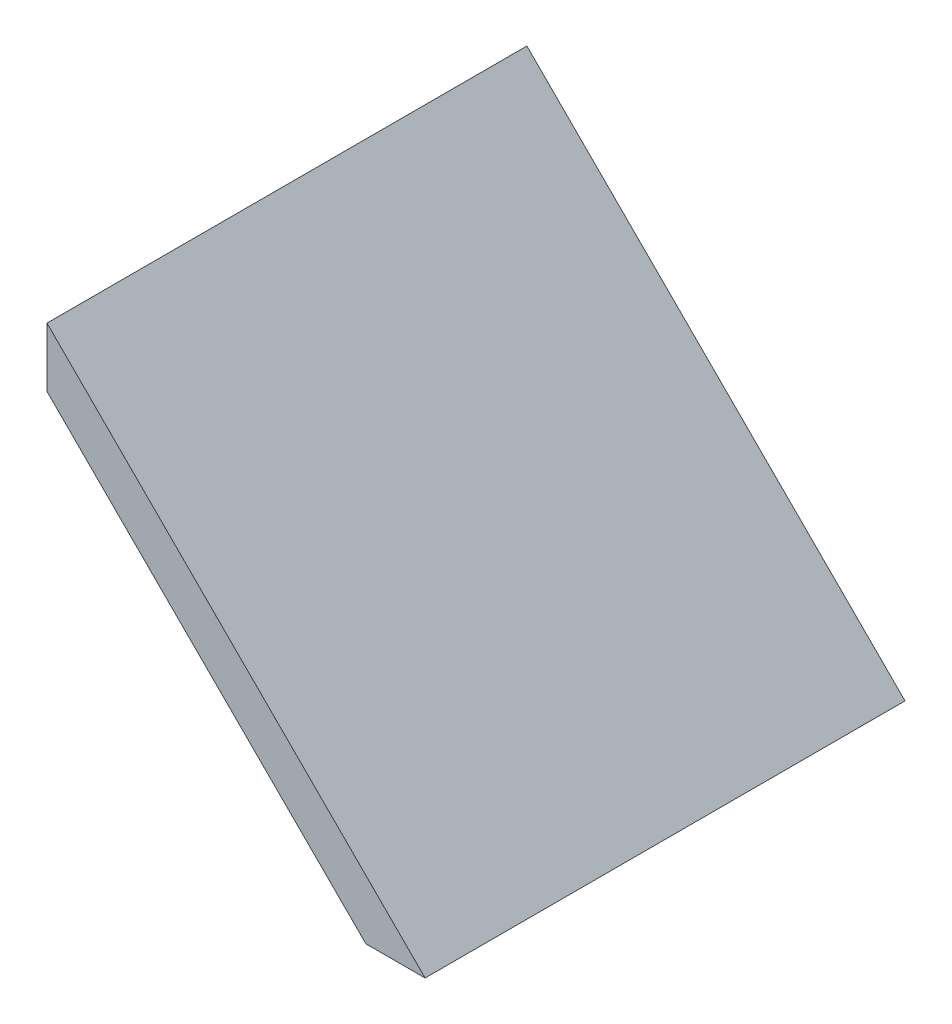
ISO-10303-21;
HEADER;
FILE_DESCRIPTION(('STEP AP214'),'2;1');
FILE_NAME('part.step','',(''),(''),'','','');
FILE_SCHEMA(('AUTOMOTIVE_DESIGN { 1 0 10303 214 1 1 1 1 }'));
ENDSEC;
DATA;
#1=APPLICATION_CONTEXT('core data for automotive mechanical design processes');
#2=APPLICATION_PROTOCOL_DEFINITION('international standard','automotive_design',2000,#1);
#3=PRODUCT_CONTEXT('',#1,'mechanical');
#4=PRODUCT('Part','Part','',(#3));
#5=PRODUCT_RELATED_PRODUCT_CATEGORY('part','',(#4));
#6=PRODUCT_DEFINITION_FORMATION('','',#4);
#7=PRODUCT_DEFINITION_CONTEXT('part definition',#1,'design');
#8=PRODUCT_DEFINITION('design','',#6,#7);
#9=PRODUCT_DEFINITION_SHAPE('','',#8);
#10=(LENGTH_UNIT() NAMED_UNIT(*) SI_UNIT(.MILLI.,.METRE.));
#11=(NAMED_UNIT(*) PLANE_ANGLE_UNIT() SI_UNIT($,.RADIAN.));
#12=(NAMED_UNIT(*) SI_UNIT($,.STERADIAN.) SOLID_ANGLE_UNIT());
#13=UNCERTAINTY_MEASURE_WITH_UNIT(LENGTH_MEASURE(1.E-05),#10,'distance_accuracy_value','');
#14=(GEOMETRIC_REPRESENTATION_CONTEXT(3) GLOBAL_UNCERTAINTY_ASSIGNED_CONTEXT((#13)) GLOBAL_UNIT_ASSIGNED_CONTEXT((#10,
#11,#12)) REPRESENTATION_CONTEXT('',''));
#15=CARTESIAN_POINT('',(0.,0.,0.));
#16=DIRECTION('',(0.,0.,1.));
#17=DIRECTION('',(1.,0.,0.));
#18=AXIS2_PLACEMENT_3D('',#15,#16,#17);
#19=CARTESIAN_POINT('',(135.513203435596,0.,172.));
#20=DIRECTION('',(0.,1.,0.));
#21=DIRECTION('',(-1.,0.,0.));
#22=AXIS2_PLACEMENT_3D('',#19,#20,#21);
#23=PLANE('',#22);
#24=DIRECTION('',(1.,0.,0.));
#25=VECTOR('',#24,1.);
#26=CARTESIAN_POINT('',(135.513203435596,0.,0.));
#27=LINE('',#26,#25);
#28=CARTESIAN_POINT('',(114.3,0.,0.));
#29=VERTEX_POINT('',#28);
#30=CARTESIAN_POINT('',(135.513203435596,0.,0.));
#31=VERTEX_POINT('',#30);
#32=EDGE_CURVE('E107',#29,#31,#27,.T.);
#33=ORIENTED_EDGE('',*,*,#32,.T.);
#34=DIRECTION('',(0.,0.,-1.));
#35=VECTOR('',#34,1.);
#36=CARTESIAN_POINT('',(135.513203435596,0.,172.));
#37=LINE('',#36,#35);
#38=CARTESIAN_POINT('',(135.513203435596,0.,172.));
#39=VERTEX_POINT('',#38);
#40=EDGE_CURVE('E11',#39,#31,#37,.T.);
#41=ORIENTED_EDGE('',*,*,#40,.F.);
#42=DIRECTION('',(1.,0.,0.));
#43=VECTOR('',#42,1.);
#44=CARTESIAN_POINT('',(135.513203435596,0.,172.));
#45=LINE('',#44,#43);
#46=CARTESIAN_POINT('',(114.3,0.,172.));
#47=VERTEX_POINT('',#46);
#48=EDGE_CURVE('E91',#47,#39,#45,.T.);
#49=ORIENTED_EDGE('',*,*,#48,.F.);
#50=DIRECTION('',(0.,0.,-1.));
#51=VECTOR('',#50,1.);
#52=CARTESIAN_POINT('',(114.3,0.,172.));
#53=LINE('',#52,#51);
#54=EDGE_CURVE('E103',#47,#29,#53,.T.);
#55=ORIENTED_EDGE('',*,*,#54,.T.);
#56=EDGE_LOOP('',(#33,#41,#49,#55));
#57=FACE_BOUND('',#56,.T.);
#58=ADVANCED_FACE('F39',(#57),#23,.F.);
#59=CARTESIAN_POINT('',(0.,135.513203435596,172.));
#60=DIRECTION('',(-0.707106781186547,-0.707106781186548,0.));
#61=DIRECTION('',(0.707106781186548,-0.707106781186547,0.));
#62=AXIS2_PLACEMENT_3D('',#59,#60,#61);
#63=PLANE('',#62);
#64=DIRECTION('',(-0.707106781186548,0.707106781186547,0.));
#65=VECTOR('',#64,1.);
#66=CARTESIAN_POINT('',(0.,135.513203435596,0.));
#67=LINE('',#66,#65);
#68=CARTESIAN_POINT('',(0.,135.513203435596,0.));
#69=VERTEX_POINT('',#68);
#70=EDGE_CURVE('E96',#31,#69,#67,.T.);
#71=ORIENTED_EDGE('',*,*,#70,.T.);
#72=DIRECTION('',(0.,0.,-1.));
#73=VECTOR('',#72,1.);
#74=CARTESIAN_POINT('',(0.,135.513203435596,172.));
#75=LINE('',#74,#73);
#76=CARTESIAN_POINT('',(0.,135.513203435596,172.));
#77=VERTEX_POINT('',#76);
#78=EDGE_CURVE('E48',#77,#69,#75,.T.);
#79=ORIENTED_EDGE('',*,*,#78,.F.);
#80=DIRECTION('',(-0.707106781186548,0.707106781186547,0.));
#81=VECTOR('',#80,1.);
#82=CARTESIAN_POINT('',(0.,135.513203435596,172.));
#83=LINE('',#82,#81);
#84=EDGE_CURVE('E86',#39,#77,#83,.T.);
#85=ORIENTED_EDGE('',*,*,#84,.F.);
#86=ORIENTED_EDGE('',*,*,#40,.T.);
#87=EDGE_LOOP('',(#71,#79,#85,#86));
#88=FACE_BOUND('',#87,.T.);
#89=ADVANCED_FACE('F95',(#88),#63,.F.);
#90=CARTESIAN_POINT('',(0.,114.3,172.));
#91=DIRECTION('',(1.,0.,0.));
#92=DIRECTION('',(0.,1.,0.));
#93=AXIS2_PLACEMENT_3D('',#90,#91,#92);
#94=PLANE('',#93);
#95=DIRECTION('',(0.,-1.,0.));
#96=VECTOR('',#95,1.);
#97=CARTESIAN_POINT('',(0.,114.3,0.));
#98=LINE('',#97,#96);
#99=CARTESIAN_POINT('',(0.,114.3,0.));
#100=VERTEX_POINT('',#99);
#101=EDGE_CURVE('E73',#69,#100,#98,.T.);
#102=ORIENTED_EDGE('',*,*,#101,.T.);
#103=DIRECTION('',(0.,0.,-1.));
#104=VECTOR('',#103,1.);
#105=CARTESIAN_POINT('',(0.,114.3,172.));
#106=LINE('',#105,#104);
#107=CARTESIAN_POINT('',(0.,114.3,172.));
#108=VERTEX_POINT('',#107);
#109=EDGE_CURVE('E98',#108,#100,#106,.T.);
#110=ORIENTED_EDGE('',*,*,#109,.F.);
#111=DIRECTION('',(0.,-1.,0.));
#112=VECTOR('',#111,1.);
#113=CARTESIAN_POINT('',(0.,114.3,172.));
#114=LINE('',#113,#112);
#115=EDGE_CURVE('E89',#77,#108,#114,.T.);
#116=ORIENTED_EDGE('',*,*,#115,.F.);
#117=ORIENTED_EDGE('',*,*,#78,.T.);
#118=EDGE_LOOP('',(#102,#110,#116,#117));
#119=FACE_BOUND('',#118,.T.);
#120=ADVANCED_FACE('F99',(#119),#94,.F.);
#121=CARTESIAN_POINT('',(114.3,0.,172.));
#122=DIRECTION('',(0.707106781186548,0.707106781186548,0.));
#123=DIRECTION('',(-0.707106781186548,0.707106781186548,0.));
#124=AXIS2_PLACEMENT_3D('',#121,#122,#123);
#125=PLANE('',#124);
#126=DIRECTION('',(0.707106781186548,-0.707106781186548,0.));
#127=VECTOR('',#126,1.);
#128=CARTESIAN_POINT('',(114.3,0.,0.));
#129=LINE('',#128,#127);
#130=EDGE_CURVE('E79',#100,#29,#129,.T.);
#131=ORIENTED_EDGE('',*,*,#130,.T.);
#132=ORIENTED_EDGE('',*,*,#54,.F.);
#133=DIRECTION('',(0.707106781186548,-0.707106781186548,0.));
#134=VECTOR('',#133,1.);
#135=CARTESIAN_POINT('',(114.3,0.,172.));
#136=LINE('',#135,#134);
#137=EDGE_CURVE('E56',#108,#47,#136,.T.);
#138=ORIENTED_EDGE('',*,*,#137,.F.);
#139=ORIENTED_EDGE('',*,*,#109,.T.);
#140=EDGE_LOOP('',(#131,#132,#138,#139));
#141=FACE_BOUND('',#140,.T.);
#142=ADVANCED_FACE('F120',(#141),#125,.F.);
#143=CARTESIAN_POINT('',(0.,0.,172.));
#144=DIRECTION('',(0.,0.,-1.));
#145=DIRECTION('',(-1.,0.,0.));
#146=AXIS2_PLACEMENT_3D('',#143,#144,#145);
#147=PLANE('',#146);
#148=ORIENTED_EDGE('',*,*,#48,.T.);
#149=ORIENTED_EDGE('',*,*,#84,.T.);
#150=ORIENTED_EDGE('',*,*,#115,.T.);
#151=ORIENTED_EDGE('',*,*,#137,.T.);
#152=EDGE_LOOP('',(#148,#149,#150,#151));
#153=FACE_BOUND('',#152,.T.);
#154=ADVANCED_FACE('F87',(#153),#147,.F.);
#155=CARTESIAN_POINT('',(0.,0.,0.));
#156=DIRECTION('',(0.,0.,-1.));
#157=DIRECTION('',(-1.,0.,0.));
#158=AXIS2_PLACEMENT_3D('',#155,#156,#157);
#159=PLANE('',#158);
#160=ORIENTED_EDGE('',*,*,#32,.F.);
#161=ORIENTED_EDGE('',*,*,#130,.F.);
#162=ORIENTED_EDGE('',*,*,#101,.F.);
#163=ORIENTED_EDGE('',*,*,#70,.F.);
#164=EDGE_LOOP('',(#160,#161,#162,#163));
#165=FACE_BOUND('',#164,.T.);
#166=ADVANCED_FACE('F123',(#165),#159,.T.);
#167=CLOSED_SHELL('',(#58,#89,#120,#142,#154,#166));
#168=MANIFOLD_SOLID_BREP('B2',#167);
#169=ADVANCED_BREP_SHAPE_REPRESENTATION('',(#18,#168),#14);
#170=SHAPE_DEFINITION_REPRESENTATION(#9,#169);
ENDSEC;
END-ISO-10303-21;
